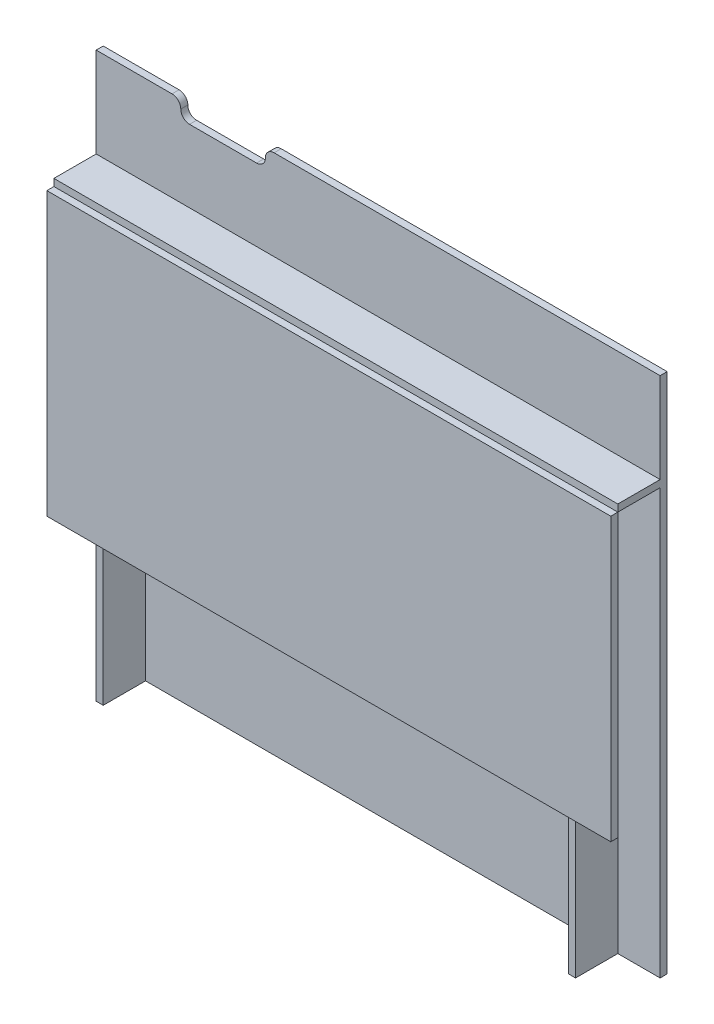
ISO-10303-21;
HEADER;
FILE_DESCRIPTION(('STEP AP214'),'2;1');
FILE_NAME('part.step','',(''),(''),'','','');
FILE_SCHEMA(('AUTOMOTIVE_DESIGN { 1 0 10303 214 1 1 1 1 }'));
ENDSEC;
DATA;
#1=APPLICATION_CONTEXT('core data for automotive mechanical design processes');
#2=APPLICATION_PROTOCOL_DEFINITION('international standard','automotive_design',2000,#1);
#3=PRODUCT_CONTEXT('',#1,'mechanical');
#4=PRODUCT('Part','Part','',(#3));
#5=PRODUCT_RELATED_PRODUCT_CATEGORY('part','',(#4));
#6=PRODUCT_DEFINITION_FORMATION('','',#4);
#7=PRODUCT_DEFINITION_CONTEXT('part definition',#1,'design');
#8=PRODUCT_DEFINITION('design','',#6,#7);
#9=PRODUCT_DEFINITION_SHAPE('','',#8);
#10=(LENGTH_UNIT() NAMED_UNIT(*) SI_UNIT(.MILLI.,.METRE.));
#11=(NAMED_UNIT(*) PLANE_ANGLE_UNIT() SI_UNIT($,.RADIAN.));
#12=(NAMED_UNIT(*) SI_UNIT($,.STERADIAN.) SOLID_ANGLE_UNIT());
#13=UNCERTAINTY_MEASURE_WITH_UNIT(LENGTH_MEASURE(1.E-05),#10,'distance_accuracy_value','');
#14=(GEOMETRIC_REPRESENTATION_CONTEXT(3) GLOBAL_UNCERTAINTY_ASSIGNED_CONTEXT((#13)) GLOBAL_UNIT_ASSIGNED_CONTEXT((#10,
#11,#12)) REPRESENTATION_CONTEXT('',''));
#15=CARTESIAN_POINT('',(0.,0.,0.));
#16=DIRECTION('',(0.,0.,1.));
#17=DIRECTION('',(1.,0.,0.));
#18=AXIS2_PLACEMENT_3D('',#15,#16,#17);
#19=CARTESIAN_POINT('',(-508.,295.099232019842,101.6));
#20=DIRECTION('',(1.,0.,0.));
#21=DIRECTION('',(0.,0.,-1.));
#22=AXIS2_PLACEMENT_3D('',#19,#20,#21);
#23=PLANE('',#22);
#24=DIRECTION('',(0.,-1.,0.));
#25=VECTOR('',#24,1.);
#26=CARTESIAN_POINT('',(-508.,295.099232019842,88.9));
#27=LINE('',#26,#25);
#28=CARTESIAN_POINT('',(-508.,295.099232019842,88.9));
#29=VERTEX_POINT('',#28);
#30=CARTESIAN_POINT('',(-508.,-212.900767980158,88.9));
#31=VERTEX_POINT('',#30);
#32=EDGE_CURVE('E117',#29,#31,#27,.T.);
#33=ORIENTED_EDGE('',*,*,#32,.T.);
#34=DIRECTION('',(0.,0.,-1.));
#35=VECTOR('',#34,1.);
#36=CARTESIAN_POINT('',(-508.,-212.900767980158,101.6));
#37=LINE('',#36,#35);
#38=CARTESIAN_POINT('',(-508.,-212.900767980158,101.6));
#39=VERTEX_POINT('',#38);
#40=EDGE_CURVE('E12',#39,#31,#37,.T.);
#41=ORIENTED_EDGE('',*,*,#40,.F.);
#42=DIRECTION('',(0.,-1.,0.));
#43=VECTOR('',#42,1.);
#44=CARTESIAN_POINT('',(-508.,295.099232019842,101.6));
#45=LINE('',#44,#43);
#46=CARTESIAN_POINT('',(-508.,295.099232019842,101.6));
#47=VERTEX_POINT('',#46);
#48=EDGE_CURVE('E105',#47,#39,#45,.T.);
#49=ORIENTED_EDGE('',*,*,#48,.F.);
#50=DIRECTION('',(0.,0.,-1.));
#51=VECTOR('',#50,1.);
#52=CARTESIAN_POINT('',(-508.,295.099232019842,101.6));
#53=LINE('',#52,#51);
#54=EDGE_CURVE('E113',#47,#29,#53,.T.);
#55=ORIENTED_EDGE('',*,*,#54,.T.);
#56=EDGE_LOOP('',(#33,#41,#49,#55));
#57=FACE_BOUND('',#56,.T.);
#58=ADVANCED_FACE('F54',(#57),#23,.F.);
#59=CARTESIAN_POINT('',(-508.,-212.900767980158,101.6));
#60=DIRECTION('',(0.,1.,0.));
#61=DIRECTION('',(0.,0.,1.));
#62=AXIS2_PLACEMENT_3D('',#59,#60,#61);
#63=PLANE('',#62);
#64=DIRECTION('',(1.,0.,0.));
#65=VECTOR('',#64,1.);
#66=CARTESIAN_POINT('',(-508.,-212.900767980158,88.9));
#67=LINE('',#66,#65);
#68=CARTESIAN_POINT('',(508.,-212.900767980158,88.9));
#69=VERTEX_POINT('',#68);
#70=EDGE_CURVE('E109',#31,#69,#67,.T.);
#71=ORIENTED_EDGE('',*,*,#70,.T.);
#72=DIRECTION('',(0.,0.,-1.));
#73=VECTOR('',#72,1.);
#74=CARTESIAN_POINT('',(508.,-212.900767980158,101.6));
#75=LINE('',#74,#73);
#76=CARTESIAN_POINT('',(508.,-212.900767980158,101.6));
#77=VERTEX_POINT('',#76);
#78=EDGE_CURVE('E62',#77,#69,#75,.T.);
#79=ORIENTED_EDGE('',*,*,#78,.F.);
#80=DIRECTION('',(1.,0.,0.));
#81=VECTOR('',#80,1.);
#82=CARTESIAN_POINT('',(-508.,-212.900767980158,101.6));
#83=LINE('',#82,#81);
#84=EDGE_CURVE('E100',#39,#77,#83,.T.);
#85=ORIENTED_EDGE('',*,*,#84,.F.);
#86=ORIENTED_EDGE('',*,*,#40,.T.);
#87=EDGE_LOOP('',(#71,#79,#85,#86));
#88=FACE_BOUND('',#87,.T.);
#89=ADVANCED_FACE('F108',(#88),#63,.F.);
#90=CARTESIAN_POINT('',(508.,295.099232019842,101.6));
#91=DIRECTION('',(-1.,0.,0.));
#92=DIRECTION('',(0.,-1.,0.));
#93=AXIS2_PLACEMENT_3D('',#90,#91,#92);
#94=PLANE('',#93);
#95=DIRECTION('',(0.,1.,0.));
#96=VECTOR('',#95,1.);
#97=CARTESIAN_POINT('',(508.,295.099232019842,88.9));
#98=LINE('',#97,#96);
#99=CARTESIAN_POINT('',(508.,295.099232019842,88.9));
#100=VERTEX_POINT('',#99);
#101=EDGE_CURVE('E87',#69,#100,#98,.T.);
#102=ORIENTED_EDGE('',*,*,#101,.T.);
#103=DIRECTION('',(0.,0.,-1.));
#104=VECTOR('',#103,1.);
#105=CARTESIAN_POINT('',(508.,295.099232019842,101.6));
#106=LINE('',#105,#104);
#107=CARTESIAN_POINT('',(508.,295.099232019842,101.6));
#108=VERTEX_POINT('',#107);
#109=EDGE_CURVE('E110',#108,#100,#106,.T.);
#110=ORIENTED_EDGE('',*,*,#109,.F.);
#111=DIRECTION('',(0.,1.,0.));
#112=VECTOR('',#111,1.);
#113=CARTESIAN_POINT('',(508.,295.099232019842,101.6));
#114=LINE('',#113,#112);
#115=EDGE_CURVE('E103',#77,#108,#114,.T.);
#116=ORIENTED_EDGE('',*,*,#115,.F.);
#117=ORIENTED_EDGE('',*,*,#78,.T.);
#118=EDGE_LOOP('',(#102,#110,#116,#117));
#119=FACE_BOUND('',#118,.T.);
#120=ADVANCED_FACE('F111',(#119),#94,.F.);
#121=CARTESIAN_POINT('',(-508.,295.099232019842,101.6));
#122=DIRECTION('',(0.,-1.,0.));
#123=DIRECTION('',(0.,0.,-1.));
#124=AXIS2_PLACEMENT_3D('',#121,#122,#123);
#125=PLANE('',#124);
#126=DIRECTION('',(-1.,0.,0.));
#127=VECTOR('',#126,1.);
#128=CARTESIAN_POINT('',(-508.,295.099232019842,88.9));
#129=LINE('',#128,#127);
#130=EDGE_CURVE('E93',#100,#29,#129,.T.);
#131=ORIENTED_EDGE('',*,*,#130,.T.);
#132=ORIENTED_EDGE('',*,*,#54,.F.);
#133=DIRECTION('',(-1.,0.,0.));
#134=VECTOR('',#133,1.);
#135=CARTESIAN_POINT('',(-508.,295.099232019842,101.6));
#136=LINE('',#135,#134);
#137=EDGE_CURVE('E70',#108,#47,#136,.T.);
#138=ORIENTED_EDGE('',*,*,#137,.F.);
#139=ORIENTED_EDGE('',*,*,#109,.T.);
#140=EDGE_LOOP('',(#131,#132,#138,#139));
#141=FACE_BOUND('',#140,.T.);
#142=ADVANCED_FACE('F124',(#141),#125,.F.);
#143=CARTESIAN_POINT('',(0.,0.,101.6));
#144=DIRECTION('',(0.,0.,1.));
#145=DIRECTION('',(1.,0.,0.));
#146=AXIS2_PLACEMENT_3D('',#143,#144,#145);
#147=PLANE('',#146);
#148=ORIENTED_EDGE('',*,*,#48,.T.);
#149=ORIENTED_EDGE('',*,*,#84,.T.);
#150=ORIENTED_EDGE('',*,*,#115,.T.);
#151=ORIENTED_EDGE('',*,*,#137,.T.);
#152=EDGE_LOOP('',(#148,#149,#150,#151));
#153=FACE_BOUND('',#152,.T.);
#154=ADVANCED_FACE('F101',(#153),#147,.T.);
#155=CARTESIAN_POINT('',(0.,0.,88.9));
#156=DIRECTION('',(0.,0.,1.));
#157=DIRECTION('',(1.,0.,0.));
#158=AXIS2_PLACEMENT_3D('',#155,#156,#157);
#159=PLANE('',#158);
#160=ORIENTED_EDGE('',*,*,#32,.F.);
#161=ORIENTED_EDGE('',*,*,#130,.F.);
#162=ORIENTED_EDGE('',*,*,#101,.F.);
#163=ORIENTED_EDGE('',*,*,#70,.F.);
#164=EDGE_LOOP('',(#160,#161,#162,#163));
#165=FACE_BOUND('',#164,.T.);
#166=ADVANCED_FACE('F127',(#165),#159,.F.);
#167=CLOSED_SHELL('',(#58,#89,#120,#142,#154,#166));
#168=MANIFOLD_SOLID_BREP('B2',#167);
#169=CARTESIAN_POINT('',(0.,0.,12.7));
#170=DIRECTION('',(0.,0.,-1.));
#171=DIRECTION('',(-1.,0.,0.));
#172=AXIS2_PLACEMENT_3D('',#169,#170,#171);
#173=PLANE('',#172);
#174=DIRECTION('',(0.,1.,0.));
#175=VECTOR('',#174,1.);
#176=CARTESIAN_POINT('',(431.8,-469.9,12.7));
#177=LINE('',#176,#175);
#178=CARTESIAN_POINT('',(431.8,-469.9,12.7));
#179=VERTEX_POINT('',#178);
#180=CARTESIAN_POINT('',(431.8,295.099232019842,12.7));
#181=VERTEX_POINT('',#180);
#182=EDGE_CURVE('E354',#179,#181,#177,.T.);
#183=ORIENTED_EDGE('',*,*,#182,.F.);
#184=DIRECTION('',(1.,0.,0.));
#185=VECTOR('',#184,1.);
#186=CARTESIAN_POINT('',(-508.,-469.9,12.7));
#187=LINE('',#186,#185);
#188=CARTESIAN_POINT('',(508.,-469.9,12.7));
#189=VERTEX_POINT('',#188);
#190=EDGE_CURVE('E366',#179,#189,#187,.T.);
#191=ORIENTED_EDGE('',*,*,#190,.T.);
#192=DIRECTION('',(0.,1.,0.));
#193=VECTOR('',#192,1.);
#194=CARTESIAN_POINT('',(508.,-469.9,12.7));
#195=LINE('',#194,#193);
#196=CARTESIAN_POINT('',(508.,295.099232019842,12.7));
#197=VERTEX_POINT('',#196);
#198=EDGE_CURVE('E506',#189,#197,#195,.T.);
#199=ORIENTED_EDGE('',*,*,#198,.T.);
#200=DIRECTION('',(1.,0.,0.));
#201=VECTOR('',#200,1.);
#202=CARTESIAN_POINT('',(-508.,295.099232019842,12.7));
#203=LINE('',#202,#201);
#204=EDGE_CURVE('E368',#181,#197,#203,.T.);
#205=ORIENTED_EDGE('',*,*,#204,.F.);
#206=EDGE_LOOP('',(#183,#191,#199,#205));
#207=FACE_BOUND('',#206,.T.);
#208=ADVANCED_FACE('F190',(#207),#173,.F.);
#209=DIRECTION('',(0.,-1.,0.));
#210=VECTOR('',#209,1.);
#211=CARTESIAN_POINT('',(419.1,-469.9,12.7));
#212=LINE('',#211,#210);
#213=CARTESIAN_POINT('',(419.1,295.099232019842,12.7));
#214=VERTEX_POINT('',#213);
#215=CARTESIAN_POINT('',(419.1,-469.9,12.7));
#216=VERTEX_POINT('',#215);
#217=EDGE_CURVE('E371',#214,#216,#212,.T.);
#218=ORIENTED_EDGE('',*,*,#217,.F.);
#219=CARTESIAN_POINT('',(-419.1,295.099232019842,12.7));
#220=VERTEX_POINT('',#219);
#221=EDGE_CURVE('E639',#220,#214,#203,.T.);
#222=ORIENTED_EDGE('',*,*,#221,.F.);
#223=DIRECTION('',(0.,1.,0.));
#224=VECTOR('',#223,1.);
#225=CARTESIAN_POINT('',(-419.1,-469.9,12.7));
#226=LINE('',#225,#224);
#227=CARTESIAN_POINT('',(-419.1,-469.9,12.7));
#228=VERTEX_POINT('',#227);
#229=EDGE_CURVE('E633',#228,#220,#226,.T.);
#230=ORIENTED_EDGE('',*,*,#229,.F.);
#231=EDGE_CURVE('E378',#228,#216,#187,.T.);
#232=ORIENTED_EDGE('',*,*,#231,.T.);
#233=EDGE_LOOP('',(#218,#222,#230,#232));
#234=FACE_BOUND('',#233,.T.);
#235=ADVANCED_FACE('F601',(#234),#173,.F.);
#236=CARTESIAN_POINT('',(-508.,295.099232019842,88.9));
#237=DIRECTION('',(0.,1.,0.));
#238=DIRECTION('',(0.,0.,1.));
#239=AXIS2_PLACEMENT_3D('',#236,#237,#238);
#240=PLANE('',#239);
#241=DIRECTION('',(0.,0.,-1.));
#242=VECTOR('',#241,1.);
#243=CARTESIAN_POINT('',(431.8,295.099232019842,88.9));
#244=LINE('',#243,#242);
#245=CARTESIAN_POINT('',(431.8,295.099232019842,88.9));
#246=VERTEX_POINT('',#245);
#247=EDGE_CURVE('E206',#246,#181,#244,.T.);
#248=ORIENTED_EDGE('',*,*,#247,.T.);
#249=ORIENTED_EDGE('',*,*,#204,.T.);
#250=DIRECTION('',(0.,0.,-1.));
#251=VECTOR('',#250,1.);
#252=CARTESIAN_POINT('',(508.,295.099232019842,88.9));
#253=LINE('',#252,#251);
#254=CARTESIAN_POINT('',(508.,295.099232019842,88.9));
#255=VERTEX_POINT('',#254);
#256=EDGE_CURVE('E547',#255,#197,#253,.T.);
#257=ORIENTED_EDGE('',*,*,#256,.F.);
#258=DIRECTION('',(1.,0.,0.));
#259=VECTOR('',#258,1.);
#260=CARTESIAN_POINT('',(-508.,295.099232019842,88.9));
#261=LINE('',#260,#259);
#262=EDGE_CURVE('E656',#246,#255,#261,.T.);
#263=ORIENTED_EDGE('',*,*,#262,.F.);
#264=EDGE_LOOP('',(#248,#249,#257,#263));
#265=FACE_BOUND('',#264,.T.);
#266=ADVANCED_FACE('F606',(#265),#240,.F.);
#267=DIRECTION('',(0.,0.,-1.));
#268=VECTOR('',#267,1.);
#269=CARTESIAN_POINT('',(419.1,295.099232019842,88.9));
#270=LINE('',#269,#268);
#271=CARTESIAN_POINT('',(419.1,295.099232019842,88.9));
#272=VERTEX_POINT('',#271);
#273=EDGE_CURVE('E900',#272,#214,#270,.T.);
#274=ORIENTED_EDGE('',*,*,#273,.F.);
#275=CARTESIAN_POINT('',(-419.1,295.099232019842,88.9));
#276=VERTEX_POINT('',#275);
#277=EDGE_CURVE('E660',#276,#272,#261,.T.);
#278=ORIENTED_EDGE('',*,*,#277,.F.);
#279=DIRECTION('',(0.,0.,-1.));
#280=VECTOR('',#279,1.);
#281=CARTESIAN_POINT('',(-419.1,295.099232019842,88.9));
#282=LINE('',#281,#280);
#283=EDGE_CURVE('E214',#276,#220,#282,.T.);
#284=ORIENTED_EDGE('',*,*,#283,.T.);
#285=ORIENTED_EDGE('',*,*,#221,.T.);
#286=EDGE_LOOP('',(#274,#278,#284,#285));
#287=FACE_BOUND('',#286,.T.);
#288=ADVANCED_FACE('F620',(#287),#240,.F.);
#289=DIRECTION('',(0.,-1.,0.));
#290=VECTOR('',#289,1.);
#291=CARTESIAN_POINT('',(-431.8,-469.9,12.7));
#292=LINE('',#291,#290);
#293=CARTESIAN_POINT('',(-431.8,295.099232019842,12.7));
#294=VERTEX_POINT('',#293);
#295=CARTESIAN_POINT('',(-431.8,-469.9,12.7));
#296=VERTEX_POINT('',#295);
#297=EDGE_CURVE('E370',#294,#296,#292,.T.);
#298=ORIENTED_EDGE('',*,*,#297,.F.);
#299=CARTESIAN_POINT('',(-508.,295.099232019842,12.7));
#300=VERTEX_POINT('',#299);
#301=EDGE_CURVE('E628',#300,#294,#203,.T.);
#302=ORIENTED_EDGE('',*,*,#301,.F.);
#303=DIRECTION('',(0.,-1.,0.));
#304=VECTOR('',#303,1.);
#305=CARTESIAN_POINT('',(-508.,-469.9,12.7));
#306=LINE('',#305,#304);
#307=CARTESIAN_POINT('',(-508.,-469.9,12.7));
#308=VERTEX_POINT('',#307);
#309=EDGE_CURVE('E385',#300,#308,#306,.T.);
#310=ORIENTED_EDGE('',*,*,#309,.T.);
#311=EDGE_CURVE('E381',#308,#296,#187,.T.);
#312=ORIENTED_EDGE('',*,*,#311,.T.);
#313=EDGE_LOOP('',(#298,#302,#310,#312));
#314=FACE_BOUND('',#313,.T.);
#315=ADVANCED_FACE('F608',(#314),#173,.F.);
#316=DIRECTION('',(0.,0.,-1.));
#317=VECTOR('',#316,1.);
#318=CARTESIAN_POINT('',(-431.8,295.099232019842,88.9));
#319=LINE('',#318,#317);
#320=CARTESIAN_POINT('',(-431.8,295.099232019842,88.9));
#321=VERTEX_POINT('',#320);
#322=EDGE_CURVE('E636',#321,#294,#319,.T.);
#323=ORIENTED_EDGE('',*,*,#322,.F.);
#324=CARTESIAN_POINT('',(-508.,295.099232019842,88.9));
#325=VERTEX_POINT('',#324);
#326=EDGE_CURVE('E657',#325,#321,#261,.T.);
#327=ORIENTED_EDGE('',*,*,#326,.F.);
#328=DIRECTION('',(0.,0.,-1.));
#329=VECTOR('',#328,1.);
#330=CARTESIAN_POINT('',(-508.,295.099232019842,88.9));
#331=LINE('',#330,#329);
#332=EDGE_CURVE('E502',#325,#300,#331,.T.);
#333=ORIENTED_EDGE('',*,*,#332,.T.);
#334=ORIENTED_EDGE('',*,*,#301,.T.);
#335=EDGE_LOOP('',(#323,#327,#333,#334));
#336=FACE_BOUND('',#335,.T.);
#337=ADVANCED_FACE('F612',(#336),#240,.F.);
#338=DIRECTION('',(-1.,0.,0.));
#339=VECTOR('',#338,1.);
#340=CARTESIAN_POINT('',(-508.,307.799232019842,12.7));
#341=LINE('',#340,#339);
#342=CARTESIAN_POINT('',(508.,307.799232019842,12.7));
#343=VERTEX_POINT('',#342);
#344=CARTESIAN_POINT('',(-508.,307.799232019842,12.7));
#345=VERTEX_POINT('',#344);
#346=EDGE_CURVE('E552',#343,#345,#341,.T.);
#347=ORIENTED_EDGE('',*,*,#346,.F.);
#348=CARTESIAN_POINT('',(508.,469.9,12.7));
#349=VERTEX_POINT('',#348);
#350=EDGE_CURVE('E510',#343,#349,#195,.T.);
#351=ORIENTED_EDGE('',*,*,#350,.T.);
#352=DIRECTION('',(-1.,0.,0.));
#353=VECTOR('',#352,1.);
#354=CARTESIAN_POINT('',(-508.,469.9,12.7));
#355=LINE('',#354,#353);
#356=CARTESIAN_POINT('',(-187.452,469.9,12.7));
#357=VERTEX_POINT('',#356);
#358=EDGE_CURVE('E511',#349,#357,#355,.T.);
#359=ORIENTED_EDGE('',*,*,#358,.T.);
#360=CARTESIAN_POINT('',(-187.452,454.152,12.7));
#361=DIRECTION('',(0.,0.,-1.));
#362=DIRECTION('',(-1.,0.,0.));
#363=AXIS2_PLACEMENT_3D('',#360,#361,#362);
#364=CIRCLE('',#363,15.748);
#365=CARTESIAN_POINT('',(-203.2,454.152,12.7));
#366=VERTEX_POINT('',#365);
#367=EDGE_CURVE('E433',#357,#366,#364,.F.);
#368=ORIENTED_EDGE('',*,*,#367,.T.);
#369=DIRECTION('',(0.,-1.,0.));
#370=VECTOR('',#369,1.);
#371=CARTESIAN_POINT('',(-203.2,0.,12.7));
#372=LINE('',#371,#370);
#373=CARTESIAN_POINT('',(-203.2,453.898,12.7));
#374=VERTEX_POINT('',#373);
#375=EDGE_CURVE('E486',#366,#374,#372,.T.);
#376=ORIENTED_EDGE('',*,*,#375,.T.);
#377=CARTESIAN_POINT('',(-218.948,453.898,12.7));
#378=DIRECTION('',(0.,0.,-1.));
#379=DIRECTION('',(-1.,0.,0.));
#380=AXIS2_PLACEMENT_3D('',#377,#378,#379);
#381=CIRCLE('',#380,15.748);
#382=CARTESIAN_POINT('',(-218.948,438.15,12.7));
#383=VERTEX_POINT('',#382);
#384=EDGE_CURVE('E52',#374,#383,#381,.T.);
#385=ORIENTED_EDGE('',*,*,#384,.T.);
#386=DIRECTION('',(-1.,0.,0.));
#387=VECTOR('',#386,1.);
#388=CARTESIAN_POINT('',(0.,438.15,12.7));
#389=LINE('',#388,#387);
#390=CARTESIAN_POINT('',(-339.852,438.15,12.7));
#391=VERTEX_POINT('',#390);
#392=EDGE_CURVE('E484',#383,#391,#389,.T.);
#393=ORIENTED_EDGE('',*,*,#392,.T.);
#394=CARTESIAN_POINT('',(-339.852,453.898,12.7));
#395=DIRECTION('',(0.,0.,-1.));
#396=DIRECTION('',(-1.,0.,0.));
#397=AXIS2_PLACEMENT_3D('',#394,#395,#396);
#398=CIRCLE('',#397,15.748);
#399=CARTESIAN_POINT('',(-355.6,453.898,12.7));
#400=VERTEX_POINT('',#399);
#401=EDGE_CURVE('E457',#391,#400,#398,.T.);
#402=ORIENTED_EDGE('',*,*,#401,.T.);
#403=DIRECTION('',(0.,-1.,0.));
#404=VECTOR('',#403,1.);
#405=CARTESIAN_POINT('',(-355.6,0.,12.7));
#406=LINE('',#405,#404);
#407=CARTESIAN_POINT('',(-355.6,454.152,12.7));
#408=VERTEX_POINT('',#407);
#409=EDGE_CURVE('E496',#408,#400,#406,.T.);
#410=ORIENTED_EDGE('',*,*,#409,.F.);
#411=CARTESIAN_POINT('',(-371.348,454.152,12.7));
#412=DIRECTION('',(0.,0.,-1.));
#413=DIRECTION('',(-1.,0.,0.));
#414=AXIS2_PLACEMENT_3D('',#411,#412,#413);
#415=CIRCLE('',#414,15.748);
#416=CARTESIAN_POINT('',(-371.348,469.9,12.7));
#417=VERTEX_POINT('',#416);
#418=EDGE_CURVE('E430',#408,#417,#415,.F.);
#419=ORIENTED_EDGE('',*,*,#418,.T.);
#420=CARTESIAN_POINT('',(-508.,469.9,12.7));
#421=VERTEX_POINT('',#420);
#422=EDGE_CURVE('E509',#417,#421,#355,.T.);
#423=ORIENTED_EDGE('',*,*,#422,.T.);
#424=EDGE_CURVE('E379',#421,#345,#306,.T.);
#425=ORIENTED_EDGE('',*,*,#424,.T.);
#426=EDGE_LOOP('',(#347,#351,#359,#368,#376,#385,#393,#402,#410,#419,#423,#425));
#427=FACE_BOUND('',#426,.T.);
#428=ADVANCED_FACE('F483',(#427),#173,.F.);
#429=CARTESIAN_POINT('',(-508.,469.9,12.7));
#430=DIRECTION('',(0.,-1.,0.));
#431=DIRECTION('',(0.,0.,-1.));
#432=AXIS2_PLACEMENT_3D('',#429,#430,#431);
#433=PLANE('',#432);
#434=ORIENTED_EDGE('',*,*,#422,.F.);
#435=DIRECTION('',(0.,0.,-1.));
#436=VECTOR('',#435,1.);
#437=CARTESIAN_POINT('',(-371.348,469.9,0.));
#438=LINE('',#437,#436);
#439=CARTESIAN_POINT('',(-371.348,469.9,0.));
#440=VERTEX_POINT('',#439);
#441=EDGE_CURVE('E436',#417,#440,#438,.T.);
#442=ORIENTED_EDGE('',*,*,#441,.T.);
#443=DIRECTION('',(-1.,0.,0.));
#444=VECTOR('',#443,1.);
#445=CARTESIAN_POINT('',(-508.,469.9,0.));
#446=LINE('',#445,#444);
#447=CARTESIAN_POINT('',(-508.,469.9,0.));
#448=VERTEX_POINT('',#447);
#449=EDGE_CURVE('E495',#440,#448,#446,.T.);
#450=ORIENTED_EDGE('',*,*,#449,.T.);
#451=DIRECTION('',(0.,0.,-1.));
#452=VECTOR('',#451,1.);
#453=CARTESIAN_POINT('',(-508.,469.9,12.7));
#454=LINE('',#453,#452);
#455=EDGE_CURVE('E401',#421,#448,#454,.T.);
#456=ORIENTED_EDGE('',*,*,#455,.F.);
#457=EDGE_LOOP('',(#434,#442,#450,#456));
#458=FACE_BOUND('',#457,.T.);
#459=ADVANCED_FACE('F526',(#458),#433,.F.);
#460=CARTESIAN_POINT('',(0.,0.,0.));
#461=DIRECTION('',(0.,0.,-1.));
#462=DIRECTION('',(-1.,0.,0.));
#463=AXIS2_PLACEMENT_3D('',#460,#461,#462);
#464=PLANE('',#463);
#465=DIRECTION('',(0.,-1.,0.));
#466=VECTOR('',#465,1.);
#467=CARTESIAN_POINT('',(-203.2,0.,0.));
#468=LINE('',#467,#466);
#469=CARTESIAN_POINT('',(-203.2,454.152,0.));
#470=VERTEX_POINT('',#469);
#471=CARTESIAN_POINT('',(-203.2,453.898,0.));
#472=VERTEX_POINT('',#471);
#473=EDGE_CURVE('E465',#470,#472,#468,.T.);
#474=ORIENTED_EDGE('',*,*,#473,.F.);
#475=CARTESIAN_POINT('',(-187.452,454.152,0.));
#476=DIRECTION('',(0.,0.,-1.));
#477=DIRECTION('',(-1.,0.,0.));
#478=AXIS2_PLACEMENT_3D('',#475,#476,#477);
#479=CIRCLE('',#478,15.748);
#480=CARTESIAN_POINT('',(-187.452,469.9,0.));
#481=VERTEX_POINT('',#480);
#482=EDGE_CURVE('E424',#470,#481,#479,.T.);
#483=ORIENTED_EDGE('',*,*,#482,.T.);
#484=CARTESIAN_POINT('',(508.,469.9,0.));
#485=VERTEX_POINT('',#484);
#486=EDGE_CURVE('E574',#485,#481,#446,.T.);
#487=ORIENTED_EDGE('',*,*,#486,.F.);
#488=DIRECTION('',(0.,1.,0.));
#489=VECTOR('',#488,1.);
#490=CARTESIAN_POINT('',(508.,-469.9,0.));
#491=LINE('',#490,#489);
#492=CARTESIAN_POINT('',(508.,-469.9,0.));
#493=VERTEX_POINT('',#492);
#494=EDGE_CURVE('E491',#493,#485,#491,.T.);
#495=ORIENTED_EDGE('',*,*,#494,.F.);
#496=DIRECTION('',(1.,0.,0.));
#497=VECTOR('',#496,1.);
#498=CARTESIAN_POINT('',(-508.,-469.9,0.));
#499=LINE('',#498,#497);
#500=CARTESIAN_POINT('',(-508.,-469.9,0.));
#501=VERTEX_POINT('',#500);
#502=EDGE_CURVE('E404',#501,#493,#499,.T.);
#503=ORIENTED_EDGE('',*,*,#502,.F.);
#504=DIRECTION('',(0.,-1.,0.));
#505=VECTOR('',#504,1.);
#506=CARTESIAN_POINT('',(-508.,-469.9,0.));
#507=LINE('',#506,#505);
#508=EDGE_CURVE('E572',#448,#501,#507,.T.);
#509=ORIENTED_EDGE('',*,*,#508,.F.);
#510=ORIENTED_EDGE('',*,*,#449,.F.);
#511=CARTESIAN_POINT('',(-371.348,454.152,0.));
#512=DIRECTION('',(0.,0.,-1.));
#513=DIRECTION('',(-1.,0.,0.));
#514=AXIS2_PLACEMENT_3D('',#511,#512,#513);
#515=CIRCLE('',#514,15.748);
#516=CARTESIAN_POINT('',(-355.6,454.152,0.));
#517=VERTEX_POINT('',#516);
#518=EDGE_CURVE('E421',#440,#517,#515,.T.);
#519=ORIENTED_EDGE('',*,*,#518,.T.);
#520=DIRECTION('',(0.,-1.,0.));
#521=VECTOR('',#520,1.);
#522=CARTESIAN_POINT('',(-355.6,0.,0.));
#523=LINE('',#522,#521);
#524=CARTESIAN_POINT('',(-355.6,453.898,0.));
#525=VERTEX_POINT('',#524);
#526=EDGE_CURVE('E477',#517,#525,#523,.T.);
#527=ORIENTED_EDGE('',*,*,#526,.T.);
#528=CARTESIAN_POINT('',(-339.852,453.898,0.));
#529=DIRECTION('',(0.,0.,-1.));
#530=DIRECTION('',(-1.,0.,0.));
#531=AXIS2_PLACEMENT_3D('',#528,#529,#530);
#532=CIRCLE('',#531,15.748);
#533=CARTESIAN_POINT('',(-339.852,438.15,0.));
#534=VERTEX_POINT('',#533);
#535=EDGE_CURVE('E454',#525,#534,#532,.F.);
#536=ORIENTED_EDGE('',*,*,#535,.T.);
#537=DIRECTION('',(-1.,0.,0.));
#538=VECTOR('',#537,1.);
#539=CARTESIAN_POINT('',(0.,438.15,0.));
#540=LINE('',#539,#538);
#541=CARTESIAN_POINT('',(-218.948,438.15,0.));
#542=VERTEX_POINT('',#541);
#543=EDGE_CURVE('E467',#542,#534,#540,.T.);
#544=ORIENTED_EDGE('',*,*,#543,.F.);
#545=CARTESIAN_POINT('',(-218.948,453.898,0.));
#546=DIRECTION('',(0.,0.,-1.));
#547=DIRECTION('',(-1.,0.,0.));
#548=AXIS2_PLACEMENT_3D('',#545,#546,#547);
#549=CIRCLE('',#548,15.748);
#550=EDGE_CURVE('E199',#542,#472,#549,.F.);
#551=ORIENTED_EDGE('',*,*,#550,.T.);
#552=EDGE_LOOP('',(#474,#483,#487,#495,#503,#509,#510,#519,#527,#536,#544,#551));
#553=FACE_BOUND('',#552,.T.);
#554=ADVANCED_FACE('F464',(#553),#464,.T.);
#555=CARTESIAN_POINT('',(508.,-469.9,12.7));
#556=DIRECTION('',(-1.,0.,0.));
#557=DIRECTION('',(0.,0.,1.));
#558=AXIS2_PLACEMENT_3D('',#555,#556,#557);
#559=PLANE('',#558);
#560=ORIENTED_EDGE('',*,*,#494,.T.);
#561=DIRECTION('',(0.,0.,-1.));
#562=VECTOR('',#561,1.);
#563=CARTESIAN_POINT('',(508.,469.9,12.7));
#564=LINE('',#563,#562);
#565=EDGE_CURVE('E410',#349,#485,#564,.T.);
#566=ORIENTED_EDGE('',*,*,#565,.F.);
#567=ORIENTED_EDGE('',*,*,#350,.F.);
#568=DIRECTION('',(0.,0.,-1.));
#569=VECTOR('',#568,1.);
#570=CARTESIAN_POINT('',(508.,307.799232019842,88.9));
#571=LINE('',#570,#569);
#572=CARTESIAN_POINT('',(508.,307.799232019842,88.9));
#573=VERTEX_POINT('',#572);
#574=EDGE_CURVE('E541',#573,#343,#571,.T.);
#575=ORIENTED_EDGE('',*,*,#574,.F.);
#576=DIRECTION('',(0.,1.,0.));
#577=VECTOR('',#576,1.);
#578=CARTESIAN_POINT('',(508.,307.799232019842,88.9));
#579=LINE('',#578,#577);
#580=EDGE_CURVE('E549',#255,#573,#579,.T.);
#581=ORIENTED_EDGE('',*,*,#580,.F.);
#582=ORIENTED_EDGE('',*,*,#256,.T.);
#583=ORIENTED_EDGE('',*,*,#198,.F.);
#584=DIRECTION('',(0.,0.,-1.));
#585=VECTOR('',#584,1.);
#586=CARTESIAN_POINT('',(508.,-469.9,12.7));
#587=LINE('',#586,#585);
#588=EDGE_CURVE('E375',#189,#493,#587,.T.);
#589=ORIENTED_EDGE('',*,*,#588,.T.);
#590=EDGE_LOOP('',(#560,#566,#567,#575,#581,#582,#583,#589));
#591=FACE_BOUND('',#590,.T.);
#592=ADVANCED_FACE('F588',(#591),#559,.F.);
#593=ORIENTED_EDGE('',*,*,#486,.T.);
#594=DIRECTION('',(0.,0.,-1.));
#595=VECTOR('',#594,1.);
#596=CARTESIAN_POINT('',(-187.452,469.9,12.7));
#597=LINE('',#596,#595);
#598=EDGE_CURVE('E427',#481,#357,#597,.F.);
#599=ORIENTED_EDGE('',*,*,#598,.T.);
#600=ORIENTED_EDGE('',*,*,#358,.F.);
#601=ORIENTED_EDGE('',*,*,#565,.T.);
#602=EDGE_LOOP('',(#593,#599,#600,#601));
#603=FACE_BOUND('',#602,.T.);
#604=ADVANCED_FACE('F586',(#603),#433,.F.);
#605=CARTESIAN_POINT('',(-508.,-469.9,12.7));
#606=DIRECTION('',(1.,0.,0.));
#607=DIRECTION('',(0.,0.,-1.));
#608=AXIS2_PLACEMENT_3D('',#605,#606,#607);
#609=PLANE('',#608);
#610=ORIENTED_EDGE('',*,*,#508,.T.);
#611=DIRECTION('',(0.,0.,-1.));
#612=VECTOR('',#611,1.);
#613=CARTESIAN_POINT('',(-508.,-469.9,12.7));
#614=LINE('',#613,#612);
#615=EDGE_CURVE('E394',#308,#501,#614,.T.);
#616=ORIENTED_EDGE('',*,*,#615,.F.);
#617=ORIENTED_EDGE('',*,*,#309,.F.);
#618=ORIENTED_EDGE('',*,*,#332,.F.);
#619=DIRECTION('',(0.,-1.,0.));
#620=VECTOR('',#619,1.);
#621=CARTESIAN_POINT('',(-508.,307.799232019842,88.9));
#622=LINE('',#621,#620);
#623=CARTESIAN_POINT('',(-508.,307.799232019842,88.9));
#624=VERTEX_POINT('',#623);
#625=EDGE_CURVE('E537',#624,#325,#622,.T.);
#626=ORIENTED_EDGE('',*,*,#625,.F.);
#627=DIRECTION('',(0.,0.,-1.));
#628=VECTOR('',#627,1.);
#629=CARTESIAN_POINT('',(-508.,307.799232019842,88.9));
#630=LINE('',#629,#628);
#631=EDGE_CURVE('E534',#624,#345,#630,.T.);
#632=ORIENTED_EDGE('',*,*,#631,.T.);
#633=ORIENTED_EDGE('',*,*,#424,.F.);
#634=ORIENTED_EDGE('',*,*,#455,.T.);
#635=EDGE_LOOP('',(#610,#616,#617,#618,#626,#632,#633,#634));
#636=FACE_BOUND('',#635,.T.);
#637=ADVANCED_FACE('F531',(#636),#609,.F.);
#638=CARTESIAN_POINT('',(-508.,-469.9,12.7));
#639=DIRECTION('',(0.,1.,0.));
#640=DIRECTION('',(0.,0.,1.));
#641=AXIS2_PLACEMENT_3D('',#638,#639,#640);
#642=PLANE('',#641);
#643=ORIENTED_EDGE('',*,*,#502,.T.);
#644=ORIENTED_EDGE('',*,*,#588,.F.);
#645=ORIENTED_EDGE('',*,*,#190,.F.);
#646=DIRECTION('',(0.,0.,-1.));
#647=VECTOR('',#646,1.);
#648=CARTESIAN_POINT('',(431.8,-469.9,88.9));
#649=LINE('',#648,#647);
#650=CARTESIAN_POINT('',(431.8,-469.9,88.9));
#651=VERTEX_POINT('',#650);
#652=EDGE_CURVE('E351',#651,#179,#649,.T.);
#653=ORIENTED_EDGE('',*,*,#652,.F.);
#654=DIRECTION('',(1.,0.,0.));
#655=VECTOR('',#654,1.);
#656=CARTESIAN_POINT('',(431.8,-469.9,88.9));
#657=LINE('',#656,#655);
#658=CARTESIAN_POINT('',(419.1,-469.9,88.9));
#659=VERTEX_POINT('',#658);
#660=EDGE_CURVE('E360',#659,#651,#657,.T.);
#661=ORIENTED_EDGE('',*,*,#660,.F.);
#662=DIRECTION('',(0.,0.,-1.));
#663=VECTOR('',#662,1.);
#664=CARTESIAN_POINT('',(419.1,-469.9,88.9));
#665=LINE('',#664,#663);
#666=EDGE_CURVE('E361',#659,#216,#665,.T.);
#667=ORIENTED_EDGE('',*,*,#666,.T.);
#668=ORIENTED_EDGE('',*,*,#231,.F.);
#669=DIRECTION('',(0.,0.,-1.));
#670=VECTOR('',#669,1.);
#671=CARTESIAN_POINT('',(-419.1,-469.9,88.9));
#672=LINE('',#671,#670);
#673=CARTESIAN_POINT('',(-419.1,-469.9,88.9));
#674=VERTEX_POINT('',#673);
#675=EDGE_CURVE('E648',#674,#228,#672,.T.);
#676=ORIENTED_EDGE('',*,*,#675,.F.);
#677=DIRECTION('',(1.,0.,0.));
#678=VECTOR('',#677,1.);
#679=CARTESIAN_POINT('',(-431.8,-469.9,88.9));
#680=LINE('',#679,#678);
#681=CARTESIAN_POINT('',(-431.8,-469.9,88.9));
#682=VERTEX_POINT('',#681);
#683=EDGE_CURVE('E914',#682,#674,#680,.T.);
#684=ORIENTED_EDGE('',*,*,#683,.F.);
#685=DIRECTION('',(0.,0.,-1.));
#686=VECTOR('',#685,1.);
#687=CARTESIAN_POINT('',(-431.8,-469.9,88.9));
#688=LINE('',#687,#686);
#689=EDGE_CURVE('E644',#682,#296,#688,.T.);
#690=ORIENTED_EDGE('',*,*,#689,.T.);
#691=ORIENTED_EDGE('',*,*,#311,.F.);
#692=ORIENTED_EDGE('',*,*,#615,.T.);
#693=EDGE_LOOP('',(#643,#644,#645,#653,#661,#667,#668,#676,#684,#690,#691,#692));
#694=FACE_BOUND('',#693,.T.);
#695=ADVANCED_FACE('F373',(#694),#642,.F.);
#696=CARTESIAN_POINT('',(-355.6,0.,12.7));
#697=DIRECTION('',(1.,0.,0.));
#698=DIRECTION('',(0.,0.,-1.));
#699=AXIS2_PLACEMENT_3D('',#696,#697,#698);
#700=PLANE('',#699);
#701=ORIENTED_EDGE('',*,*,#526,.F.);
#702=DIRECTION('',(0.,0.,-1.));
#703=VECTOR('',#702,1.);
#704=CARTESIAN_POINT('',(-355.6,454.152,12.7));
#705=LINE('',#704,#703);
#706=EDGE_CURVE('E444',#517,#408,#705,.F.);
#707=ORIENTED_EDGE('',*,*,#706,.T.);
#708=ORIENTED_EDGE('',*,*,#409,.T.);
#709=DIRECTION('',(0.,0.,-1.));
#710=VECTOR('',#709,1.);
#711=CARTESIAN_POINT('',(-355.6,453.898,12.7));
#712=LINE('',#711,#710);
#713=EDGE_CURVE('E440',#400,#525,#712,.T.);
#714=ORIENTED_EDGE('',*,*,#713,.T.);
#715=EDGE_LOOP('',(#701,#707,#708,#714));
#716=FACE_BOUND('',#715,.T.);
#717=ADVANCED_FACE('F565',(#716),#700,.T.);
#718=CARTESIAN_POINT('',(0.,438.15,12.7));
#719=DIRECTION('',(0.,-1.,0.));
#720=DIRECTION('',(1.,0.,0.));
#721=AXIS2_PLACEMENT_3D('',#718,#719,#720);
#722=PLANE('',#721);
#723=ORIENTED_EDGE('',*,*,#543,.T.);
#724=DIRECTION('',(0.,0.,-1.));
#725=VECTOR('',#724,1.);
#726=CARTESIAN_POINT('',(-339.852,438.15,12.7));
#727=LINE('',#726,#725);
#728=EDGE_CURVE('E451',#534,#391,#727,.F.);
#729=ORIENTED_EDGE('',*,*,#728,.T.);
#730=ORIENTED_EDGE('',*,*,#392,.F.);
#731=DIRECTION('',(0.,0.,-1.));
#732=VECTOR('',#731,1.);
#733=CARTESIAN_POINT('',(-218.948,438.15,0.));
#734=LINE('',#733,#732);
#735=EDGE_CURVE('E447',#383,#542,#734,.T.);
#736=ORIENTED_EDGE('',*,*,#735,.T.);
#737=EDGE_LOOP('',(#723,#729,#730,#736));
#738=FACE_BOUND('',#737,.T.);
#739=ADVANCED_FACE('F488',(#738),#722,.F.);
#740=CARTESIAN_POINT('',(-203.2,0.,12.7));
#741=DIRECTION('',(1.,0.,0.));
#742=DIRECTION('',(0.,0.,-1.));
#743=AXIS2_PLACEMENT_3D('',#740,#741,#742);
#744=PLANE('',#743);
#745=ORIENTED_EDGE('',*,*,#375,.F.);
#746=DIRECTION('',(0.,0.,-1.));
#747=VECTOR('',#746,1.);
#748=CARTESIAN_POINT('',(-203.2,454.152,12.7));
#749=LINE('',#748,#747);
#750=EDGE_CURVE('E417',#366,#470,#749,.T.);
#751=ORIENTED_EDGE('',*,*,#750,.T.);
#752=ORIENTED_EDGE('',*,*,#473,.T.);
#753=DIRECTION('',(0.,0.,-1.));
#754=VECTOR('',#753,1.);
#755=CARTESIAN_POINT('',(-203.2,453.898,12.7));
#756=LINE('',#755,#754);
#757=EDGE_CURVE('E414',#472,#374,#756,.F.);
#758=ORIENTED_EDGE('',*,*,#757,.T.);
#759=EDGE_LOOP('',(#745,#751,#752,#758));
#760=FACE_BOUND('',#759,.T.);
#761=ADVANCED_FACE('F473',(#760),#744,.F.);
#762=CARTESIAN_POINT('',(-187.452,454.152,12.7));
#763=DIRECTION('',(0.,0.,-1.));
#764=DIRECTION('',(-1.,0.,0.));
#765=AXIS2_PLACEMENT_3D('',#762,#763,#764);
#766=CYLINDRICAL_SURFACE('',#765,15.748);
#767=ORIENTED_EDGE('',*,*,#367,.F.);
#768=ORIENTED_EDGE('',*,*,#598,.F.);
#769=ORIENTED_EDGE('',*,*,#482,.F.);
#770=ORIENTED_EDGE('',*,*,#750,.F.);
#771=EDGE_LOOP('',(#767,#768,#769,#770));
#772=FACE_BOUND('',#771,.T.);
#773=ADVANCED_FACE('F590',(#772),#766,.T.);
#774=CARTESIAN_POINT('',(-371.348,454.152,12.7));
#775=DIRECTION('',(0.,0.,1.));
#776=DIRECTION('',(1.,0.,0.));
#777=AXIS2_PLACEMENT_3D('',#774,#775,#776);
#778=CYLINDRICAL_SURFACE('',#777,15.748);
#779=ORIENTED_EDGE('',*,*,#418,.F.);
#780=ORIENTED_EDGE('',*,*,#706,.F.);
#781=ORIENTED_EDGE('',*,*,#518,.F.);
#782=ORIENTED_EDGE('',*,*,#441,.F.);
#783=EDGE_LOOP('',(#779,#780,#781,#782));
#784=FACE_BOUND('',#783,.T.);
#785=ADVANCED_FACE('F570',(#784),#778,.T.);
#786=CARTESIAN_POINT('',(-339.852,453.898,12.7));
#787=DIRECTION('',(0.,0.,-1.));
#788=DIRECTION('',(-1.,0.,0.));
#789=AXIS2_PLACEMENT_3D('',#786,#787,#788);
#790=CYLINDRICAL_SURFACE('',#789,15.748);
#791=ORIENTED_EDGE('',*,*,#401,.F.);
#792=ORIENTED_EDGE('',*,*,#728,.F.);
#793=ORIENTED_EDGE('',*,*,#535,.F.);
#794=ORIENTED_EDGE('',*,*,#713,.F.);
#795=EDGE_LOOP('',(#791,#792,#793,#794));
#796=FACE_BOUND('',#795,.T.);
#797=ADVANCED_FACE('F568',(#796),#790,.F.);
#798=CARTESIAN_POINT('',(-218.948,453.898,12.7));
#799=DIRECTION('',(0.,0.,1.));
#800=DIRECTION('',(1.,0.,0.));
#801=AXIS2_PLACEMENT_3D('',#798,#799,#800);
#802=CYLINDRICAL_SURFACE('',#801,15.748);
#803=ORIENTED_EDGE('',*,*,#384,.F.);
#804=ORIENTED_EDGE('',*,*,#757,.F.);
#805=ORIENTED_EDGE('',*,*,#550,.F.);
#806=ORIENTED_EDGE('',*,*,#735,.F.);
#807=EDGE_LOOP('',(#803,#804,#805,#806));
#808=FACE_BOUND('',#807,.T.);
#809=ADVANCED_FACE('F192',(#808),#802,.F.);
#810=CARTESIAN_POINT('',(-508.,307.799232019842,88.9));
#811=DIRECTION('',(0.,-1.,0.));
#812=DIRECTION('',(0.,0.,-1.));
#813=AXIS2_PLACEMENT_3D('',#810,#811,#812);
#814=PLANE('',#813);
#815=ORIENTED_EDGE('',*,*,#346,.T.);
#816=ORIENTED_EDGE('',*,*,#631,.F.);
#817=DIRECTION('',(-1.,0.,0.));
#818=VECTOR('',#817,1.);
#819=CARTESIAN_POINT('',(-508.,307.799232019842,88.9));
#820=LINE('',#819,#818);
#821=EDGE_CURVE('E542',#573,#624,#820,.T.);
#822=ORIENTED_EDGE('',*,*,#821,.F.);
#823=ORIENTED_EDGE('',*,*,#574,.T.);
#824=EDGE_LOOP('',(#815,#816,#822,#823));
#825=FACE_BOUND('',#824,.T.);
#826=ADVANCED_FACE('F666',(#825),#814,.F.);
#827=CARTESIAN_POINT('',(0.,0.,88.9));
#828=DIRECTION('',(0.,0.,1.));
#829=DIRECTION('',(1.,0.,0.));
#830=AXIS2_PLACEMENT_3D('',#827,#828,#829);
#831=PLANE('',#830);
#832=ORIENTED_EDGE('',*,*,#625,.T.);
#833=ORIENTED_EDGE('',*,*,#326,.T.);
#834=DIRECTION('',(0.,-1.,0.));
#835=VECTOR('',#834,1.);
#836=CARTESIAN_POINT('',(-431.8,-469.9,88.9));
#837=LINE('',#836,#835);
#838=EDGE_CURVE('E910',#321,#682,#837,.T.);
#839=ORIENTED_EDGE('',*,*,#838,.T.);
#840=ORIENTED_EDGE('',*,*,#683,.T.);
#841=DIRECTION('',(0.,1.,0.));
#842=VECTOR('',#841,1.);
#843=CARTESIAN_POINT('',(-419.1,-469.9,88.9));
#844=LINE('',#843,#842);
#845=EDGE_CURVE('E919',#674,#276,#844,.T.);
#846=ORIENTED_EDGE('',*,*,#845,.T.);
#847=ORIENTED_EDGE('',*,*,#277,.T.);
#848=DIRECTION('',(0.,-1.,0.));
#849=VECTOR('',#848,1.);
#850=CARTESIAN_POINT('',(419.1,-469.9,88.9));
#851=LINE('',#850,#849);
#852=EDGE_CURVE('E925',#272,#659,#851,.T.);
#853=ORIENTED_EDGE('',*,*,#852,.T.);
#854=ORIENTED_EDGE('',*,*,#660,.T.);
#855=DIRECTION('',(0.,1.,0.));
#856=VECTOR('',#855,1.);
#857=CARTESIAN_POINT('',(431.8,-469.9,88.9));
#858=LINE('',#857,#856);
#859=EDGE_CURVE('E355',#651,#246,#858,.T.);
#860=ORIENTED_EDGE('',*,*,#859,.T.);
#861=ORIENTED_EDGE('',*,*,#262,.T.);
#862=ORIENTED_EDGE('',*,*,#580,.T.);
#863=ORIENTED_EDGE('',*,*,#821,.T.);
#864=EDGE_LOOP('',(#832,#833,#839,#840,#846,#847,#853,#854,#860,#861,#862,#863));
#865=FACE_BOUND('',#864,.T.);
#866=ADVANCED_FACE('F664',(#865),#831,.T.);
#867=CARTESIAN_POINT('',(-431.8,-469.9,88.9));
#868=DIRECTION('',(1.,0.,0.));
#869=DIRECTION('',(0.,0.,-1.));
#870=AXIS2_PLACEMENT_3D('',#867,#868,#869);
#871=PLANE('',#870);
#872=ORIENTED_EDGE('',*,*,#297,.T.);
#873=ORIENTED_EDGE('',*,*,#689,.F.);
#874=ORIENTED_EDGE('',*,*,#838,.F.);
#875=ORIENTED_EDGE('',*,*,#322,.T.);
#876=EDGE_LOOP('',(#872,#873,#874,#875));
#877=FACE_BOUND('',#876,.T.);
#878=ADVANCED_FACE('F673',(#877),#871,.F.);
#879=CARTESIAN_POINT('',(-419.1,-469.9,88.9));
#880=DIRECTION('',(-1.,0.,0.));
#881=DIRECTION('',(0.,0.,1.));
#882=AXIS2_PLACEMENT_3D('',#879,#880,#881);
#883=PLANE('',#882);
#884=ORIENTED_EDGE('',*,*,#229,.T.);
#885=ORIENTED_EDGE('',*,*,#283,.F.);
#886=ORIENTED_EDGE('',*,*,#845,.F.);
#887=ORIENTED_EDGE('',*,*,#675,.T.);
#888=EDGE_LOOP('',(#884,#885,#886,#887));
#889=FACE_BOUND('',#888,.T.);
#890=ADVANCED_FACE('F860',(#889),#883,.F.);
#891=CARTESIAN_POINT('',(431.8,-469.9,88.9));
#892=DIRECTION('',(-1.,0.,0.));
#893=DIRECTION('',(0.,-1.,0.));
#894=AXIS2_PLACEMENT_3D('',#891,#892,#893);
#895=PLANE('',#894);
#896=ORIENTED_EDGE('',*,*,#182,.T.);
#897=ORIENTED_EDGE('',*,*,#247,.F.);
#898=ORIENTED_EDGE('',*,*,#859,.F.);
#899=ORIENTED_EDGE('',*,*,#652,.T.);
#900=EDGE_LOOP('',(#896,#897,#898,#899));
#901=FACE_BOUND('',#900,.T.);
#902=ADVANCED_FACE('F353',(#901),#895,.F.);
#903=CARTESIAN_POINT('',(419.1,-469.9,88.9));
#904=DIRECTION('',(1.,0.,0.));
#905=DIRECTION('',(0.,1.,0.));
#906=AXIS2_PLACEMENT_3D('',#903,#904,#905);
#907=PLANE('',#906);
#908=ORIENTED_EDGE('',*,*,#217,.T.);
#909=ORIENTED_EDGE('',*,*,#666,.F.);
#910=ORIENTED_EDGE('',*,*,#852,.F.);
#911=ORIENTED_EDGE('',*,*,#273,.T.);
#912=EDGE_LOOP('',(#908,#909,#910,#911));
#913=FACE_BOUND('',#912,.T.);
#914=ADVANCED_FACE('F877',(#913),#907,.F.);
#915=CLOSED_SHELL('',(#208,#235,#266,#288,#315,#337,#428,#459,#554,#592,#604,#637,#695,#717,
#739,#761,#773,#785,#797,#809,#826,#866,#878,#890,#902,#914));
#916=MANIFOLD_SOLID_BREP('B6',#915);
#917=ADVANCED_BREP_SHAPE_REPRESENTATION('',(#18,#168,#916),#14);
#918=SHAPE_DEFINITION_REPRESENTATION(#9,#917);
ENDSEC;
END-ISO-10303-21;
